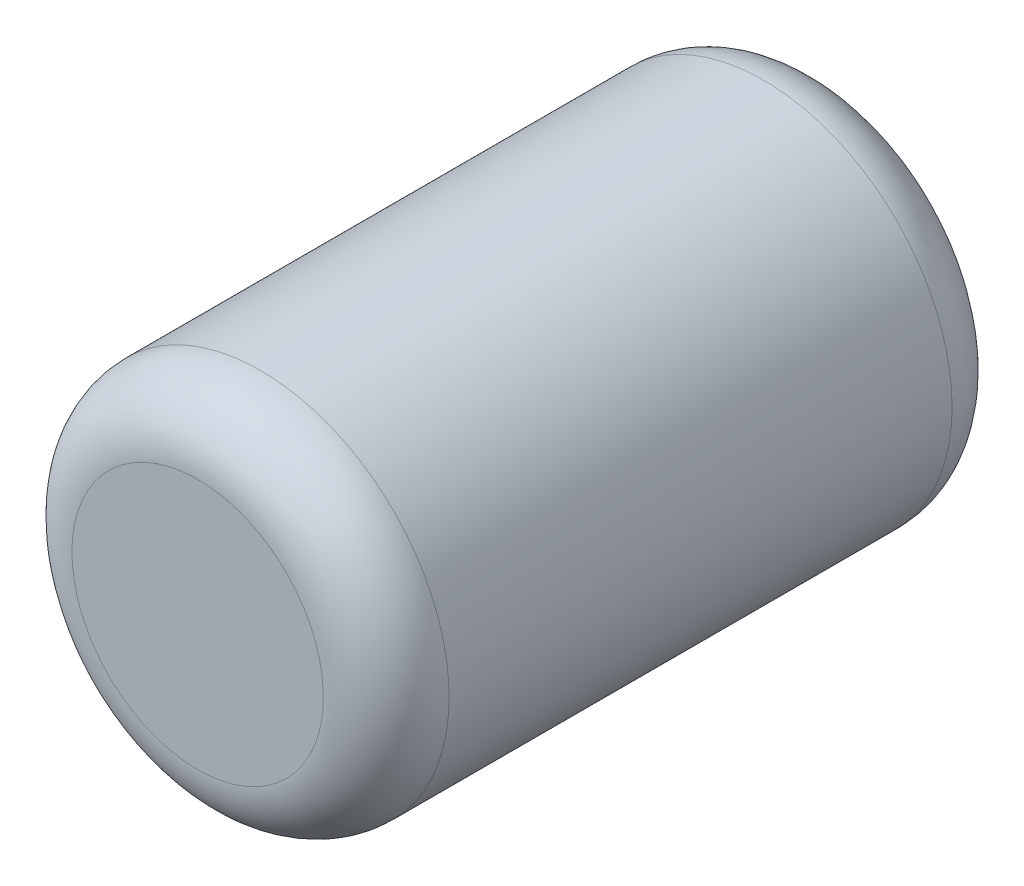
ISO-10303-21;
HEADER;
FILE_DESCRIPTION(('STEP AP214'),'2;1');
FILE_NAME('part.step','',(''),(''),'','','');
FILE_SCHEMA(('AUTOMOTIVE_DESIGN { 1 0 10303 214 1 1 1 1 }'));
ENDSEC;
DATA;
#1=APPLICATION_CONTEXT('core data for automotive mechanical design processes');
#2=APPLICATION_PROTOCOL_DEFINITION('international standard','automotive_design',2000,#1);
#3=PRODUCT_CONTEXT('',#1,'mechanical');
#4=PRODUCT('Part','Part','',(#3));
#5=PRODUCT_RELATED_PRODUCT_CATEGORY('part','',(#4));
#6=PRODUCT_DEFINITION_FORMATION('','',#4);
#7=PRODUCT_DEFINITION_CONTEXT('part definition',#1,'design');
#8=PRODUCT_DEFINITION('design','',#6,#7);
#9=PRODUCT_DEFINITION_SHAPE('','',#8);
#10=(LENGTH_UNIT() NAMED_UNIT(*) SI_UNIT(.MILLI.,.METRE.));
#11=(NAMED_UNIT(*) PLANE_ANGLE_UNIT() SI_UNIT($,.RADIAN.));
#12=(NAMED_UNIT(*) SI_UNIT($,.STERADIAN.) SOLID_ANGLE_UNIT());
#13=UNCERTAINTY_MEASURE_WITH_UNIT(LENGTH_MEASURE(1.E-05),#10,'distance_accuracy_value','');
#14=(GEOMETRIC_REPRESENTATION_CONTEXT(3) GLOBAL_UNCERTAINTY_ASSIGNED_CONTEXT((#13)) GLOBAL_UNIT_ASSIGNED_CONTEXT((#10,
#11,#12)) REPRESENTATION_CONTEXT('',''));
#15=CARTESIAN_POINT('',(0.,0.,0.));
#16=DIRECTION('',(0.,0.,1.));
#17=DIRECTION('',(1.,0.,0.));
#18=AXIS2_PLACEMENT_3D('',#15,#16,#17);
#19=CARTESIAN_POINT('',(0.,0.,0.));
#20=DIRECTION('',(0.,0.,1.));
#21=DIRECTION('',(1.,0.,0.));
#22=AXIS2_PLACEMENT_3D('',#19,#20,#21);
#23=PLANE('',#22);
#24=CARTESIAN_POINT('',(0.,0.,0.));
#25=DIRECTION('',(0.,0.,-1.));
#26=DIRECTION('',(-1.,0.,0.));
#27=AXIS2_PLACEMENT_3D('',#24,#25,#26);
#28=CIRCLE('',#27,1.);
#29=CARTESIAN_POINT('',(-1.,0.,0.));
#30=VERTEX_POINT('',#29);
#31=EDGE_CURVE('E10',#30,#30,#28,.T.);
#32=ORIENTED_EDGE('',*,*,#31,.T.);
#33=EDGE_LOOP('',(#32));
#34=FACE_BOUND('',#33,.T.);
#35=ADVANCED_FACE('F32',(#34),#23,.F.);
#36=CARTESIAN_POINT('',(0.,0.,0.5));
#37=DIRECTION('',(0.,0.,-1.));
#38=DIRECTION('',(-1.,0.,0.));
#39=AXIS2_PLACEMENT_3D('',#36,#37,#38);
#40=TOROIDAL_SURFACE('',#39,1.,0.5);
#41=ORIENTED_EDGE('',*,*,#31,.F.);
#42=EDGE_LOOP('',(#41));
#43=FACE_BOUND('',#42,.T.);
#44=CARTESIAN_POINT('',(0.,0.,0.5));
#45=DIRECTION('',(0.,0.,-1.));
#46=DIRECTION('',(-1.,0.,0.));
#47=AXIS2_PLACEMENT_3D('',#44,#45,#46);
#48=CIRCLE('',#47,1.5);
#49=CARTESIAN_POINT('',(-1.5,0.,0.5));
#50=VERTEX_POINT('',#49);
#51=EDGE_CURVE('E38',#50,#50,#48,.T.);
#52=ORIENTED_EDGE('',*,*,#51,.T.);
#53=EDGE_LOOP('',(#52));
#54=FACE_BOUND('',#53,.T.);
#55=ADVANCED_FACE('F64',(#43,#54),#40,.T.);
#56=CARTESIAN_POINT('',(0.,0.,0.));
#57=DIRECTION('',(0.,0.,-1.));
#58=DIRECTION('',(-1.,0.,0.));
#59=AXIS2_PLACEMENT_3D('',#56,#57,#58);
#60=CYLINDRICAL_SURFACE('',#59,1.5);
#61=ORIENTED_EDGE('',*,*,#51,.F.);
#62=EDGE_LOOP('',(#61));
#63=FACE_BOUND('',#62,.T.);
#64=CARTESIAN_POINT('',(0.,0.,4.5));
#65=DIRECTION('',(0.,0.,-1.));
#66=DIRECTION('',(-1.,0.,0.));
#67=AXIS2_PLACEMENT_3D('',#64,#65,#66);
#68=CIRCLE('',#67,1.5);
#69=CARTESIAN_POINT('',(-1.5,0.,4.5));
#70=VERTEX_POINT('',#69);
#71=EDGE_CURVE('E42',#70,#70,#68,.T.);
#72=ORIENTED_EDGE('',*,*,#71,.T.);
#73=EDGE_LOOP('',(#72));
#74=FACE_BOUND('',#73,.T.);
#75=ADVANCED_FACE('F60',(#63,#74),#60,.T.);
#76=CARTESIAN_POINT('',(0.,0.,4.5));
#77=DIRECTION('',(0.,0.,-1.));
#78=DIRECTION('',(-1.,0.,0.));
#79=AXIS2_PLACEMENT_3D('',#76,#77,#78);
#80=TOROIDAL_SURFACE('',#79,1.,0.5);
#81=ORIENTED_EDGE('',*,*,#71,.F.);
#82=EDGE_LOOP('',(#81));
#83=FACE_BOUND('',#82,.T.);
#84=CARTESIAN_POINT('',(0.,0.,5.));
#85=DIRECTION('',(0.,0.,-1.));
#86=DIRECTION('',(-1.,0.,0.));
#87=AXIS2_PLACEMENT_3D('',#84,#85,#86);
#88=CIRCLE('',#87,1.);
#89=CARTESIAN_POINT('',(-1.,0.,5.));
#90=VERTEX_POINT('',#89);
#91=EDGE_CURVE('E46',#90,#90,#88,.T.);
#92=ORIENTED_EDGE('',*,*,#91,.T.);
#93=EDGE_LOOP('',(#92));
#94=FACE_BOUND('',#93,.T.);
#95=ADVANCED_FACE('F52',(#83,#94),#80,.T.);
#96=CARTESIAN_POINT('',(0.,-1.,5.));
#97=DIRECTION('',(0.,0.,-1.));
#98=DIRECTION('',(-1.,0.,0.));
#99=AXIS2_PLACEMENT_3D('',#96,#97,#98);
#100=PLANE('',#99);
#101=ORIENTED_EDGE('',*,*,#91,.F.);
#102=EDGE_LOOP('',(#101));
#103=FACE_BOUND('',#102,.T.);
#104=ADVANCED_FACE('F54',(#103),#100,.F.);
#105=CLOSED_SHELL('',(#35,#55,#75,#95,#104));
#106=MANIFOLD_SOLID_BREP('B2',#105);
#107=ADVANCED_BREP_SHAPE_REPRESENTATION('',(#18,#106),#14);
#108=SHAPE_DEFINITION_REPRESENTATION(#9,#107);
ENDSEC;
END-ISO-10303-21;
